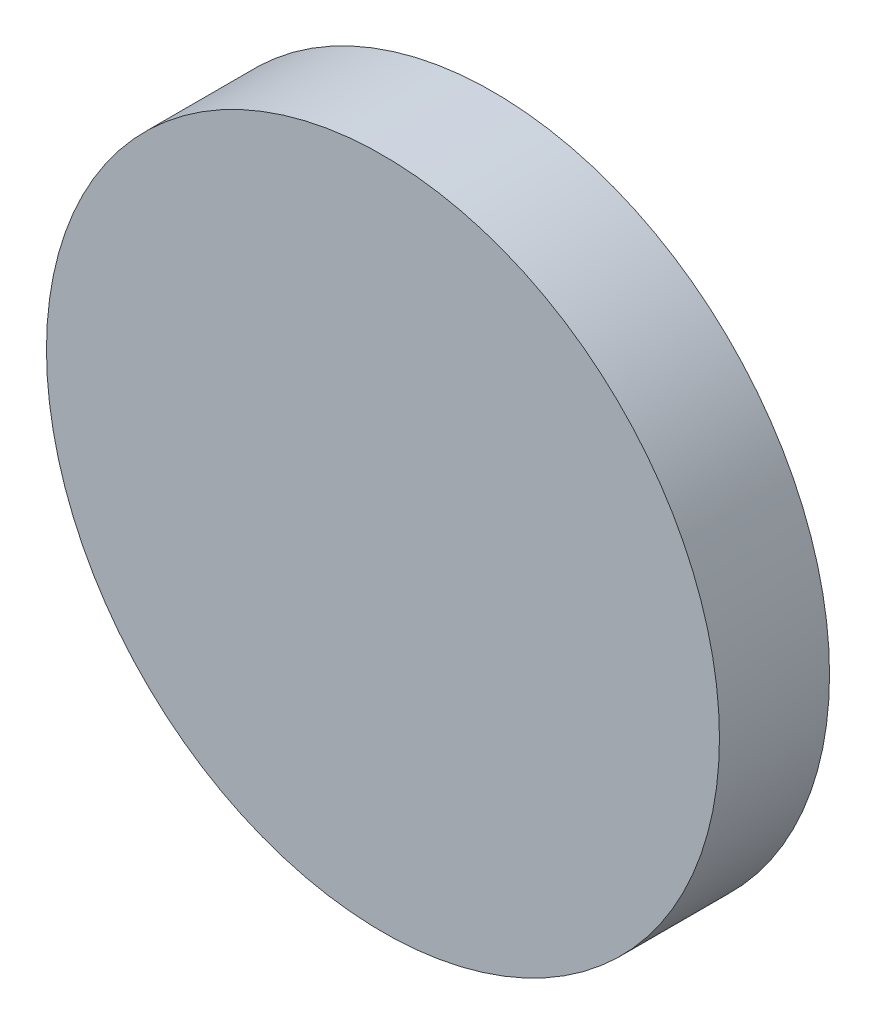
ISO-10303-21;
HEADER;
FILE_DESCRIPTION(('STEP AP214'),'2;1');
FILE_NAME('part.step','',(''),(''),'','','');
FILE_SCHEMA(('AUTOMOTIVE_DESIGN { 1 0 10303 214 1 1 1 1 }'));
ENDSEC;
DATA;
#1=APPLICATION_CONTEXT('core data for automotive mechanical design processes');
#2=APPLICATION_PROTOCOL_DEFINITION('international standard','automotive_design',2000,#1);
#3=PRODUCT_CONTEXT('',#1,'mechanical');
#4=PRODUCT('Part','Part','',(#3));
#5=PRODUCT_RELATED_PRODUCT_CATEGORY('part','',(#4));
#6=PRODUCT_DEFINITION_FORMATION('','',#4);
#7=PRODUCT_DEFINITION_CONTEXT('part definition',#1,'design');
#8=PRODUCT_DEFINITION('design','',#6,#7);
#9=PRODUCT_DEFINITION_SHAPE('','',#8);
#10=(LENGTH_UNIT() NAMED_UNIT(*) SI_UNIT(.MILLI.,.METRE.));
#11=(NAMED_UNIT(*) PLANE_ANGLE_UNIT() SI_UNIT($,.RADIAN.));
#12=(NAMED_UNIT(*) SI_UNIT($,.STERADIAN.) SOLID_ANGLE_UNIT());
#13=UNCERTAINTY_MEASURE_WITH_UNIT(LENGTH_MEASURE(1.E-05),#10,'distance_accuracy_value','');
#14=(GEOMETRIC_REPRESENTATION_CONTEXT(3) GLOBAL_UNCERTAINTY_ASSIGNED_CONTEXT((#13)) GLOBAL_UNIT_ASSIGNED_CONTEXT((#10,
#11,#12)) REPRESENTATION_CONTEXT('',''));
#15=CARTESIAN_POINT('',(0.,0.,0.));
#16=DIRECTION('',(0.,0.,1.));
#17=DIRECTION('',(1.,0.,0.));
#18=AXIS2_PLACEMENT_3D('',#15,#16,#17);
#19=CARTESIAN_POINT('',(12.49999934,6.49999934,3.049726601721));
#20=DIRECTION('',(0.,0.,1.));
#21=DIRECTION('',(0.,-1.,0.));
#22=AXIS2_PLACEMENT_3D('',#19,#20,#21);
#23=PLANE('',#22);
#24=CARTESIAN_POINT('',(12.49999934,6.49999934,3.049726601721));
#25=DIRECTION('',(0.,0.,1.));
#26=DIRECTION('',(1.,0.,0.));
#27=AXIS2_PLACEMENT_3D('',#24,#25,#26);
#28=CIRCLE('',#27,2.2);
#29=CARTESIAN_POINT('',(14.69999934,6.49999934,3.049726601721));
#30=VERTEX_POINT('',#29);
#31=EDGE_CURVE('E18',#30,#30,#28,.F.);
#32=ORIENTED_EDGE('',*,*,#31,.F.);
#33=EDGE_LOOP('',(#32));
#34=FACE_BOUND('',#33,.T.);
#35=ADVANCED_FACE('F15',(#34),#23,.T.);
#36=CARTESIAN_POINT('',(12.49999934,6.49999934,2.33));
#37=DIRECTION('',(0.,0.,1.));
#38=DIRECTION('',(1.,0.,0.));
#39=AXIS2_PLACEMENT_3D('',#36,#37,#38);
#40=CYLINDRICAL_SURFACE('',#39,2.2);
#41=CARTESIAN_POINT('',(12.49999934,6.49999934,2.33));
#42=DIRECTION('',(0.,0.,1.));
#43=DIRECTION('',(1.,0.,0.));
#44=AXIS2_PLACEMENT_3D('',#41,#42,#43);
#45=CIRCLE('',#44,2.2);
#46=CARTESIAN_POINT('',(14.69999934,6.49999934,2.33));
#47=VERTEX_POINT('',#46);
#48=EDGE_CURVE('E10',#47,#47,#45,.T.);
#49=ORIENTED_EDGE('',*,*,#48,.T.);
#50=EDGE_LOOP('',(#49));
#51=FACE_BOUND('',#50,.T.);
#52=ORIENTED_EDGE('',*,*,#31,.T.);
#53=EDGE_LOOP('',(#52));
#54=FACE_BOUND('',#53,.T.);
#55=ADVANCED_FACE('F27',(#51,#54),#40,.T.);
#56=CARTESIAN_POINT('',(12.49999934,6.49999934,2.33));
#57=DIRECTION('',(0.,0.,1.));
#58=DIRECTION('',(1.,0.,0.));
#59=AXIS2_PLACEMENT_3D('',#56,#57,#58);
#60=PLANE('',#59);
#61=ORIENTED_EDGE('',*,*,#48,.F.);
#62=EDGE_LOOP('',(#61));
#63=FACE_BOUND('',#62,.T.);
#64=ADVANCED_FACE('F34',(#63),#60,.F.);
#65=CLOSED_SHELL('',(#35,#55,#64));
#66=MANIFOLD_SOLID_BREP('B1',#65);
#67=ADVANCED_BREP_SHAPE_REPRESENTATION('',(#18,#66),#14);
#68=SHAPE_DEFINITION_REPRESENTATION(#9,#67);
ENDSEC;
END-ISO-10303-21;
